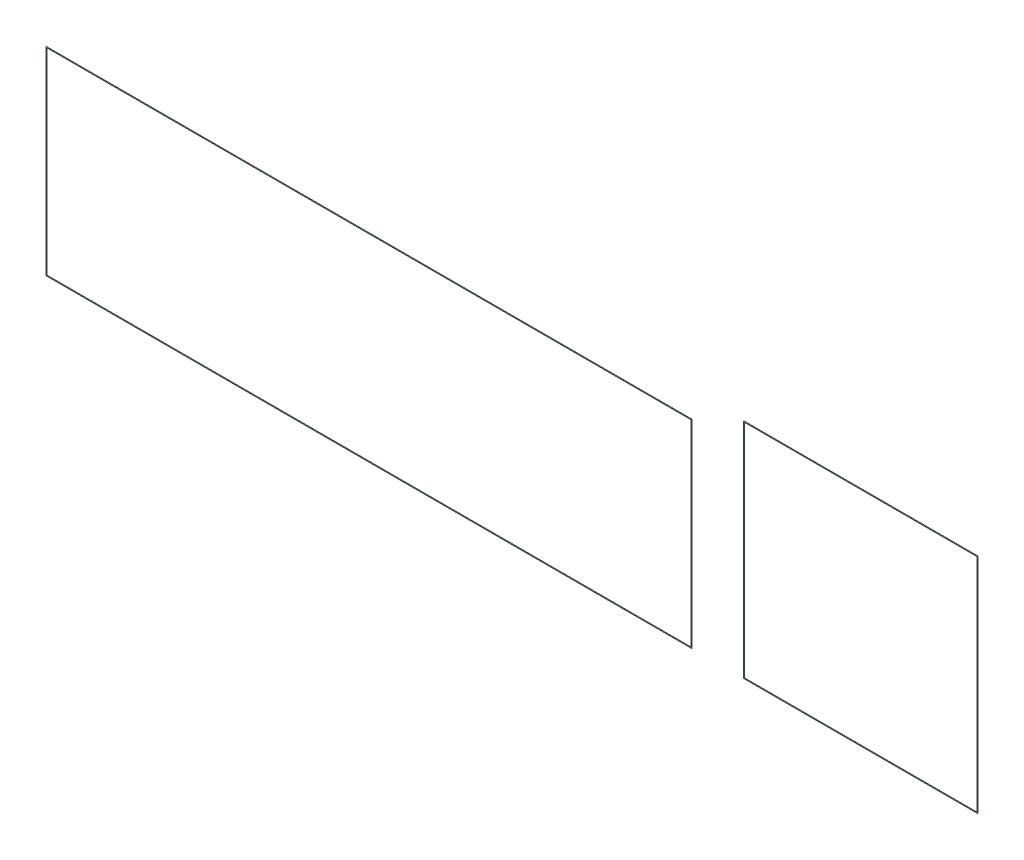
ISO-10303-21;
HEADER;
FILE_DESCRIPTION(('STEP AP214'),'2;1');
FILE_NAME('part.step','',(''),(''),'','','');
FILE_SCHEMA(('AUTOMOTIVE_DESIGN { 1 0 10303 214 1 1 1 1 }'));
ENDSEC;
DATA;
#1=APPLICATION_CONTEXT('core data for automotive mechanical design processes');
#2=APPLICATION_PROTOCOL_DEFINITION('international standard','automotive_design',2000,#1);
#3=PRODUCT_CONTEXT('',#1,'mechanical');
#4=PRODUCT('Part','Part','',(#3));
#5=PRODUCT_RELATED_PRODUCT_CATEGORY('part','',(#4));
#6=PRODUCT_DEFINITION_FORMATION('','',#4);
#7=PRODUCT_DEFINITION_CONTEXT('part definition',#1,'design');
#8=PRODUCT_DEFINITION('design','',#6,#7);
#9=PRODUCT_DEFINITION_SHAPE('','',#8);
#10=(LENGTH_UNIT() NAMED_UNIT(*) SI_UNIT(.MILLI.,.METRE.));
#11=(NAMED_UNIT(*) PLANE_ANGLE_UNIT() SI_UNIT($,.RADIAN.));
#12=(NAMED_UNIT(*) SI_UNIT($,.STERADIAN.) SOLID_ANGLE_UNIT());
#13=UNCERTAINTY_MEASURE_WITH_UNIT(LENGTH_MEASURE(1.E-05),#10,'distance_accuracy_value','');
#14=(GEOMETRIC_REPRESENTATION_CONTEXT(3) GLOBAL_UNCERTAINTY_ASSIGNED_CONTEXT((#13)) GLOBAL_UNIT_ASSIGNED_CONTEXT((#10,
#11,#12)) REPRESENTATION_CONTEXT('',''));
#15=CARTESIAN_POINT('',(0.,0.,0.));
#16=DIRECTION('',(0.,0.,1.));
#17=DIRECTION('',(1.,0.,0.));
#18=AXIS2_PLACEMENT_3D('',#15,#16,#17);
#19=CARTESIAN_POINT('',(0.,0.,1.));
#20=DIRECTION('',(0.,0.,-1.));
#21=DIRECTION('',(-1.,0.,0.));
#22=AXIS2_PLACEMENT_3D('',#19,#20,#21);
#23=PLANE('',#22);
#24=DIRECTION('',(-1.,0.,0.));
#25=VECTOR('',#24,1.);
#26=CARTESIAN_POINT('',(36391.415,12040.,1.));
#27=LINE('',#26,#25);
#28=CARTESIAN_POINT('',(59191.415,12040.,1.));
#29=VERTEX_POINT('',#28);
#30=CARTESIAN_POINT('',(36391.415,12040.,1.));
#31=VERTEX_POINT('',#30);
#32=EDGE_CURVE('E146',#29,#31,#27,.T.);
#33=ORIENTED_EDGE('',*,*,#32,.T.);
#34=DIRECTION('',(0.,-1.,0.));
#35=VECTOR('',#34,1.);
#36=CARTESIAN_POINT('',(36391.415,12040.,1.));
#37=LINE('',#36,#35);
#38=CARTESIAN_POINT('',(36391.415,-9660.,1.));
#39=VERTEX_POINT('',#38);
#40=EDGE_CURVE('E149',#31,#39,#37,.T.);
#41=ORIENTED_EDGE('',*,*,#40,.T.);
#42=DIRECTION('',(1.,0.,0.));
#43=VECTOR('',#42,1.);
#44=CARTESIAN_POINT('',(59191.415,-9660.,1.));
#45=LINE('',#44,#43);
#46=CARTESIAN_POINT('',(59191.415,-9660.,1.));
#47=VERTEX_POINT('',#46);
#48=EDGE_CURVE('E152',#39,#47,#45,.T.);
#49=ORIENTED_EDGE('',*,*,#48,.T.);
#50=DIRECTION('',(0.,1.,0.));
#51=VECTOR('',#50,1.);
#52=CARTESIAN_POINT('',(59191.415,12040.,1.));
#53=LINE('',#52,#51);
#54=EDGE_CURVE('E154',#47,#29,#53,.T.);
#55=ORIENTED_EDGE('',*,*,#54,.T.);
#56=EDGE_LOOP('',(#33,#41,#49,#55));
#57=FACE_BOUND('',#56,.T.);
#58=DIRECTION('',(1.,0.,0.));
#59=VECTOR('',#58,1.);
#60=CARTESIAN_POINT('',(59091.415,-9560.,1.));
#61=LINE('',#60,#59);
#62=CARTESIAN_POINT('',(36491.415,-9560.,1.));
#63=VERTEX_POINT('',#62);
#64=CARTESIAN_POINT('',(59091.415,-9560.,1.));
#65=VERTEX_POINT('',#64);
#66=EDGE_CURVE('E110',#63,#65,#61,.T.);
#67=ORIENTED_EDGE('',*,*,#66,.F.);
#68=DIRECTION('',(0.,-1.,0.));
#69=VECTOR('',#68,1.);
#70=CARTESIAN_POINT('',(36491.415,11940.,1.));
#71=LINE('',#70,#69);
#72=CARTESIAN_POINT('',(36491.415,11940.,1.));
#73=VERTEX_POINT('',#72);
#74=EDGE_CURVE('E132',#73,#63,#71,.T.);
#75=ORIENTED_EDGE('',*,*,#74,.F.);
#76=DIRECTION('',(-1.,0.,0.));
#77=VECTOR('',#76,1.);
#78=CARTESIAN_POINT('',(36491.415,11940.,1.));
#79=LINE('',#78,#77);
#80=CARTESIAN_POINT('',(59091.415,11940.,1.));
#81=VERTEX_POINT('',#80);
#82=EDGE_CURVE('E130',#81,#73,#79,.T.);
#83=ORIENTED_EDGE('',*,*,#82,.F.);
#84=DIRECTION('',(0.,1.,0.));
#85=VECTOR('',#84,1.);
#86=CARTESIAN_POINT('',(59091.415,11940.,1.));
#87=LINE('',#86,#85);
#88=EDGE_CURVE('E118',#65,#81,#87,.T.);
#89=ORIENTED_EDGE('',*,*,#88,.F.);
#90=EDGE_LOOP('',(#67,#75,#83,#89));
#91=FACE_BOUND('',#90,.T.);
#92=ADVANCED_FACE('F45',(#57,#91),#23,.F.);
#93=CARTESIAN_POINT('',(0.,0.,0.));
#94=DIRECTION('',(0.,0.,-1.));
#95=DIRECTION('',(-1.,0.,0.));
#96=AXIS2_PLACEMENT_3D('',#93,#94,#95);
#97=PLANE('',#96);
#98=DIRECTION('',(-1.,0.,0.));
#99=VECTOR('',#98,1.);
#100=CARTESIAN_POINT('',(36391.415,12040.,0.));
#101=LINE('',#100,#99);
#102=CARTESIAN_POINT('',(59191.415,12040.,0.));
#103=VERTEX_POINT('',#102);
#104=CARTESIAN_POINT('',(36391.415,12040.,0.));
#105=VERTEX_POINT('',#104);
#106=EDGE_CURVE('E126',#103,#105,#101,.T.);
#107=ORIENTED_EDGE('',*,*,#106,.F.);
#108=DIRECTION('',(0.,1.,0.));
#109=VECTOR('',#108,1.);
#110=CARTESIAN_POINT('',(59191.415,12040.,0.));
#111=LINE('',#110,#109);
#112=CARTESIAN_POINT('',(59191.415,-9660.,0.));
#113=VERTEX_POINT('',#112);
#114=EDGE_CURVE('E150',#113,#103,#111,.T.);
#115=ORIENTED_EDGE('',*,*,#114,.F.);
#116=DIRECTION('',(1.,0.,0.));
#117=VECTOR('',#116,1.);
#118=CARTESIAN_POINT('',(59191.415,-9660.,0.));
#119=LINE('',#118,#117);
#120=CARTESIAN_POINT('',(36391.415,-9660.,0.));
#121=VERTEX_POINT('',#120);
#122=EDGE_CURVE('E161',#121,#113,#119,.T.);
#123=ORIENTED_EDGE('',*,*,#122,.F.);
#124=DIRECTION('',(0.,-1.,0.));
#125=VECTOR('',#124,1.);
#126=CARTESIAN_POINT('',(36391.415,12040.,0.));
#127=LINE('',#126,#125);
#128=EDGE_CURVE('E159',#105,#121,#127,.T.);
#129=ORIENTED_EDGE('',*,*,#128,.F.);
#130=EDGE_LOOP('',(#107,#115,#123,#129));
#131=FACE_BOUND('',#130,.T.);
#132=DIRECTION('',(0.,-1.,0.));
#133=VECTOR('',#132,1.);
#134=CARTESIAN_POINT('',(36491.415,11940.,0.));
#135=LINE('',#134,#133);
#136=CARTESIAN_POINT('',(36491.415,11940.,0.));
#137=VERTEX_POINT('',#136);
#138=CARTESIAN_POINT('',(36491.415,-9560.,0.));
#139=VERTEX_POINT('',#138);
#140=EDGE_CURVE('E119',#137,#139,#135,.T.);
#141=ORIENTED_EDGE('',*,*,#140,.T.);
#142=DIRECTION('',(1.,0.,0.));
#143=VECTOR('',#142,1.);
#144=CARTESIAN_POINT('',(59091.415,-9560.,0.));
#145=LINE('',#144,#143);
#146=CARTESIAN_POINT('',(59091.415,-9560.,0.));
#147=VERTEX_POINT('',#146);
#148=EDGE_CURVE('E68',#139,#147,#145,.T.);
#149=ORIENTED_EDGE('',*,*,#148,.T.);
#150=DIRECTION('',(0.,1.,0.));
#151=VECTOR('',#150,1.);
#152=CARTESIAN_POINT('',(59091.415,11940.,0.));
#153=LINE('',#152,#151);
#154=CARTESIAN_POINT('',(59091.415,11940.,0.));
#155=VERTEX_POINT('',#154);
#156=EDGE_CURVE('E125',#147,#155,#153,.T.);
#157=ORIENTED_EDGE('',*,*,#156,.T.);
#158=DIRECTION('',(-1.,0.,0.));
#159=VECTOR('',#158,1.);
#160=CARTESIAN_POINT('',(36491.415,11940.,0.));
#161=LINE('',#160,#159);
#162=EDGE_CURVE('E138',#155,#137,#161,.T.);
#163=ORIENTED_EDGE('',*,*,#162,.T.);
#164=EDGE_LOOP('',(#141,#149,#157,#163));
#165=FACE_BOUND('',#164,.T.);
#166=ADVANCED_FACE('F179',(#131,#165),#97,.T.);
#167=CARTESIAN_POINT('',(36391.415,12040.,1.));
#168=DIRECTION('',(0.,-1.,0.));
#169=DIRECTION('',(0.,0.,-1.));
#170=AXIS2_PLACEMENT_3D('',#167,#168,#169);
#171=PLANE('',#170);
#172=ORIENTED_EDGE('',*,*,#106,.T.);
#173=DIRECTION('',(0.,0.,-1.));
#174=VECTOR('',#173,1.);
#175=CARTESIAN_POINT('',(36391.415,12040.,1.));
#176=LINE('',#175,#174);
#177=EDGE_CURVE('E12',#31,#105,#176,.T.);
#178=ORIENTED_EDGE('',*,*,#177,.F.);
#179=ORIENTED_EDGE('',*,*,#32,.F.);
#180=DIRECTION('',(0.,0.,-1.));
#181=VECTOR('',#180,1.);
#182=CARTESIAN_POINT('',(59191.415,12040.,1.));
#183=LINE('',#182,#181);
#184=EDGE_CURVE('E156',#29,#103,#183,.T.);
#185=ORIENTED_EDGE('',*,*,#184,.T.);
#186=EDGE_LOOP('',(#172,#178,#179,#185));
#187=FACE_BOUND('',#186,.T.);
#188=ADVANCED_FACE('F47',(#187),#171,.F.);
#189=CARTESIAN_POINT('',(36391.415,12040.,1.));
#190=DIRECTION('',(1.,0.,0.));
#191=DIRECTION('',(0.,0.,-1.));
#192=AXIS2_PLACEMENT_3D('',#189,#190,#191);
#193=PLANE('',#192);
#194=ORIENTED_EDGE('',*,*,#128,.T.);
#195=DIRECTION('',(0.,0.,-1.));
#196=VECTOR('',#195,1.);
#197=CARTESIAN_POINT('',(36391.415,-9660.,1.));
#198=LINE('',#197,#196);
#199=EDGE_CURVE('E53',#39,#121,#198,.T.);
#200=ORIENTED_EDGE('',*,*,#199,.F.);
#201=ORIENTED_EDGE('',*,*,#40,.F.);
#202=ORIENTED_EDGE('',*,*,#177,.T.);
#203=EDGE_LOOP('',(#194,#200,#201,#202));
#204=FACE_BOUND('',#203,.T.);
#205=ADVANCED_FACE('F189',(#204),#193,.F.);
#206=CARTESIAN_POINT('',(59191.415,-9660.,1.));
#207=DIRECTION('',(0.,1.,0.));
#208=DIRECTION('',(-1.,0.,0.));
#209=AXIS2_PLACEMENT_3D('',#206,#207,#208);
#210=PLANE('',#209);
#211=ORIENTED_EDGE('',*,*,#122,.T.);
#212=DIRECTION('',(0.,0.,-1.));
#213=VECTOR('',#212,1.);
#214=CARTESIAN_POINT('',(59191.415,-9660.,1.));
#215=LINE('',#214,#213);
#216=EDGE_CURVE('E166',#47,#113,#215,.T.);
#217=ORIENTED_EDGE('',*,*,#216,.F.);
#218=ORIENTED_EDGE('',*,*,#48,.F.);
#219=ORIENTED_EDGE('',*,*,#199,.T.);
#220=EDGE_LOOP('',(#211,#217,#218,#219));
#221=FACE_BOUND('',#220,.T.);
#222=ADVANCED_FACE('F173',(#221),#210,.F.);
#223=CARTESIAN_POINT('',(59191.415,12040.,1.));
#224=DIRECTION('',(-1.,0.,0.));
#225=DIRECTION('',(0.,0.,1.));
#226=AXIS2_PLACEMENT_3D('',#223,#224,#225);
#227=PLANE('',#226);
#228=ORIENTED_EDGE('',*,*,#114,.T.);
#229=ORIENTED_EDGE('',*,*,#184,.F.);
#230=ORIENTED_EDGE('',*,*,#54,.F.);
#231=ORIENTED_EDGE('',*,*,#216,.T.);
#232=EDGE_LOOP('',(#228,#229,#230,#231));
#233=FACE_BOUND('',#232,.T.);
#234=ADVANCED_FACE('F183',(#233),#227,.F.);
#235=CARTESIAN_POINT('',(59091.415,-9560.,1.));
#236=DIRECTION('',(0.,1.,0.));
#237=DIRECTION('',(-1.,0.,0.));
#238=AXIS2_PLACEMENT_3D('',#235,#236,#237);
#239=PLANE('',#238);
#240=ORIENTED_EDGE('',*,*,#148,.F.);
#241=DIRECTION('',(0.,0.,-1.));
#242=VECTOR('',#241,1.);
#243=CARTESIAN_POINT('',(36491.415,-9560.,1.));
#244=LINE('',#243,#242);
#245=EDGE_CURVE('E114',#63,#139,#244,.T.);
#246=ORIENTED_EDGE('',*,*,#245,.F.);
#247=ORIENTED_EDGE('',*,*,#66,.T.);
#248=DIRECTION('',(0.,0.,-1.));
#249=VECTOR('',#248,1.);
#250=CARTESIAN_POINT('',(59091.415,-9560.,1.));
#251=LINE('',#250,#249);
#252=EDGE_CURVE('E113',#65,#147,#251,.T.);
#253=ORIENTED_EDGE('',*,*,#252,.T.);
#254=EDGE_LOOP('',(#240,#246,#247,#253));
#255=FACE_BOUND('',#254,.T.);
#256=ADVANCED_FACE('F112',(#255),#239,.T.);
#257=CARTESIAN_POINT('',(59091.415,11940.,1.));
#258=DIRECTION('',(-1.,0.,0.));
#259=DIRECTION('',(0.,-1.,0.));
#260=AXIS2_PLACEMENT_3D('',#257,#258,#259);
#261=PLANE('',#260);
#262=ORIENTED_EDGE('',*,*,#156,.F.);
#263=ORIENTED_EDGE('',*,*,#252,.F.);
#264=ORIENTED_EDGE('',*,*,#88,.T.);
#265=DIRECTION('',(0.,0.,-1.));
#266=VECTOR('',#265,1.);
#267=CARTESIAN_POINT('',(59091.415,11940.,1.));
#268=LINE('',#267,#266);
#269=EDGE_CURVE('E127',#81,#155,#268,.T.);
#270=ORIENTED_EDGE('',*,*,#269,.T.);
#271=EDGE_LOOP('',(#262,#263,#264,#270));
#272=FACE_BOUND('',#271,.T.);
#273=ADVANCED_FACE('F122',(#272),#261,.T.);
#274=CARTESIAN_POINT('',(36491.415,11940.,1.));
#275=DIRECTION('',(0.,-1.,0.));
#276=DIRECTION('',(1.,0.,0.));
#277=AXIS2_PLACEMENT_3D('',#274,#275,#276);
#278=PLANE('',#277);
#279=ORIENTED_EDGE('',*,*,#162,.F.);
#280=ORIENTED_EDGE('',*,*,#269,.F.);
#281=ORIENTED_EDGE('',*,*,#82,.T.);
#282=DIRECTION('',(0.,0.,-1.));
#283=VECTOR('',#282,1.);
#284=CARTESIAN_POINT('',(36491.415,11940.,1.));
#285=LINE('',#284,#283);
#286=EDGE_CURVE('E60',#73,#137,#285,.T.);
#287=ORIENTED_EDGE('',*,*,#286,.T.);
#288=EDGE_LOOP('',(#279,#280,#281,#287));
#289=FACE_BOUND('',#288,.T.);
#290=ADVANCED_FACE('F212',(#289),#278,.T.);
#291=CARTESIAN_POINT('',(36491.415,11940.,1.));
#292=DIRECTION('',(1.,0.,0.));
#293=DIRECTION('',(0.,0.,-1.));
#294=AXIS2_PLACEMENT_3D('',#291,#292,#293);
#295=PLANE('',#294);
#296=ORIENTED_EDGE('',*,*,#140,.F.);
#297=ORIENTED_EDGE('',*,*,#286,.F.);
#298=ORIENTED_EDGE('',*,*,#74,.T.);
#299=ORIENTED_EDGE('',*,*,#245,.T.);
#300=EDGE_LOOP('',(#296,#297,#298,#299));
#301=FACE_BOUND('',#300,.T.);
#302=ADVANCED_FACE('F216',(#301),#295,.T.);
#303=CLOSED_SHELL('',(#92,#166,#188,#205,#222,#234,#256,#273,#290,#302));
#304=MANIFOLD_SOLID_BREP('B2_NOT_SHOWN',#303);
#305=CARTESIAN_POINT('',(0.,0.,1.));
#306=DIRECTION('',(0.,0.,1.));
#307=DIRECTION('',(1.,0.,0.));
#308=AXIS2_PLACEMENT_3D('',#305,#306,#307);
#309=PLANE('',#308);
#310=DIRECTION('',(0.,1.,0.));
#311=VECTOR('',#310,1.);
#312=CARTESIAN_POINT('',(31391.415,9660.,1.));
#313=LINE('',#312,#311);
#314=CARTESIAN_POINT('',(31391.415,-9660.,1.));
#315=VERTEX_POINT('',#314);
#316=CARTESIAN_POINT('',(31391.415,9660.,1.));
#317=VERTEX_POINT('',#316);
#318=EDGE_CURVE('E375',#315,#317,#313,.T.);
#319=ORIENTED_EDGE('',*,*,#318,.T.);
#320=DIRECTION('',(-1.,0.,0.));
#321=VECTOR('',#320,1.);
#322=CARTESIAN_POINT('',(-31391.415,9660.,1.));
#323=LINE('',#322,#321);
#324=CARTESIAN_POINT('',(-31391.415,9660.,1.));
#325=VERTEX_POINT('',#324);
#326=EDGE_CURVE('E378',#317,#325,#323,.T.);
#327=ORIENTED_EDGE('',*,*,#326,.T.);
#328=DIRECTION('',(0.,-1.,0.));
#329=VECTOR('',#328,1.);
#330=CARTESIAN_POINT('',(-31391.415,9660.,1.));
#331=LINE('',#330,#329);
#332=CARTESIAN_POINT('',(-31391.415,-9660.,1.));
#333=VERTEX_POINT('',#332);
#334=EDGE_CURVE('E381',#325,#333,#331,.T.);
#335=ORIENTED_EDGE('',*,*,#334,.T.);
#336=DIRECTION('',(1.,0.,0.));
#337=VECTOR('',#336,1.);
#338=CARTESIAN_POINT('',(-31391.415,-9660.,1.));
#339=LINE('',#338,#337);
#340=EDGE_CURVE('E383',#333,#315,#339,.T.);
#341=ORIENTED_EDGE('',*,*,#340,.T.);
#342=EDGE_LOOP('',(#319,#327,#335,#341));
#343=FACE_BOUND('',#342,.T.);
#344=DIRECTION('',(0.,-1.,0.));
#345=VECTOR('',#344,1.);
#346=CARTESIAN_POINT('',(-31291.415,9560.,1.));
#347=LINE('',#346,#345);
#348=CARTESIAN_POINT('',(-31291.415,9560.,1.));
#349=VERTEX_POINT('',#348);
#350=CARTESIAN_POINT('',(-31291.415,-9560.,1.));
#351=VERTEX_POINT('',#350);
#352=EDGE_CURVE('E347',#349,#351,#347,.T.);
#353=ORIENTED_EDGE('',*,*,#352,.F.);
#354=DIRECTION('',(-1.,0.,0.));
#355=VECTOR('',#354,1.);
#356=CARTESIAN_POINT('',(-31291.415,9560.,1.));
#357=LINE('',#356,#355);
#358=CARTESIAN_POINT('',(31291.415,9560.,1.));
#359=VERTEX_POINT('',#358);
#360=EDGE_CURVE('E339',#359,#349,#357,.T.);
#361=ORIENTED_EDGE('',*,*,#360,.F.);
#362=DIRECTION('',(0.,1.,0.));
#363=VECTOR('',#362,1.);
#364=CARTESIAN_POINT('',(31291.415,9560.,1.));
#365=LINE('',#364,#363);
#366=CARTESIAN_POINT('',(31291.415,-9560.,1.));
#367=VERTEX_POINT('',#366);
#368=EDGE_CURVE('E361',#367,#359,#365,.T.);
#369=ORIENTED_EDGE('',*,*,#368,.F.);
#370=DIRECTION('',(1.,0.,0.));
#371=VECTOR('',#370,1.);
#372=CARTESIAN_POINT('',(-31291.415,-9560.,1.));
#373=LINE('',#372,#371);
#374=EDGE_CURVE('E359',#351,#367,#373,.T.);
#375=ORIENTED_EDGE('',*,*,#374,.F.);
#376=EDGE_LOOP('',(#353,#361,#369,#375));
#377=FACE_BOUND('',#376,.T.);
#378=ADVANCED_FACE('F274',(#343,#377),#309,.T.);
#379=CARTESIAN_POINT('',(0.,0.,0.));
#380=DIRECTION('',(0.,0.,1.));
#381=DIRECTION('',(1.,0.,0.));
#382=AXIS2_PLACEMENT_3D('',#379,#380,#381);
#383=PLANE('',#382);
#384=DIRECTION('',(0.,1.,0.));
#385=VECTOR('',#384,1.);
#386=CARTESIAN_POINT('',(31391.415,9660.,0.));
#387=LINE('',#386,#385);
#388=CARTESIAN_POINT('',(31391.415,-9660.,0.));
#389=VERTEX_POINT('',#388);
#390=CARTESIAN_POINT('',(31391.415,9660.,0.));
#391=VERTEX_POINT('',#390);
#392=EDGE_CURVE('E355',#389,#391,#387,.T.);
#393=ORIENTED_EDGE('',*,*,#392,.F.);
#394=DIRECTION('',(1.,0.,0.));
#395=VECTOR('',#394,1.);
#396=CARTESIAN_POINT('',(-31391.415,-9660.,0.));
#397=LINE('',#396,#395);
#398=CARTESIAN_POINT('',(-31391.415,-9660.,0.));
#399=VERTEX_POINT('',#398);
#400=EDGE_CURVE('E379',#399,#389,#397,.T.);
#401=ORIENTED_EDGE('',*,*,#400,.F.);
#402=DIRECTION('',(0.,-1.,0.));
#403=VECTOR('',#402,1.);
#404=CARTESIAN_POINT('',(-31391.415,9660.,0.));
#405=LINE('',#404,#403);
#406=CARTESIAN_POINT('',(-31391.415,9660.,0.));
#407=VERTEX_POINT('',#406);
#408=EDGE_CURVE('E390',#407,#399,#405,.T.);
#409=ORIENTED_EDGE('',*,*,#408,.F.);
#410=DIRECTION('',(-1.,0.,0.));
#411=VECTOR('',#410,1.);
#412=CARTESIAN_POINT('',(-31391.415,9660.,0.));
#413=LINE('',#412,#411);
#414=EDGE_CURVE('E388',#391,#407,#413,.T.);
#415=ORIENTED_EDGE('',*,*,#414,.F.);
#416=EDGE_LOOP('',(#393,#401,#409,#415));
#417=FACE_BOUND('',#416,.T.);
#418=DIRECTION('',(-1.,0.,0.));
#419=VECTOR('',#418,1.);
#420=CARTESIAN_POINT('',(-31291.415,9560.,0.));
#421=LINE('',#420,#419);
#422=CARTESIAN_POINT('',(31291.415,9560.,0.));
#423=VERTEX_POINT('',#422);
#424=CARTESIAN_POINT('',(-31291.415,9560.,0.));
#425=VERTEX_POINT('',#424);
#426=EDGE_CURVE('E297',#423,#425,#421,.T.);
#427=ORIENTED_EDGE('',*,*,#426,.T.);
#428=DIRECTION('',(0.,-1.,0.));
#429=VECTOR('',#428,1.);
#430=CARTESIAN_POINT('',(-31291.415,9560.,0.));
#431=LINE('',#430,#429);
#432=CARTESIAN_POINT('',(-31291.415,-9560.,0.));
#433=VERTEX_POINT('',#432);
#434=EDGE_CURVE('E354',#425,#433,#431,.T.);
#435=ORIENTED_EDGE('',*,*,#434,.T.);
#436=DIRECTION('',(1.,0.,0.));
#437=VECTOR('',#436,1.);
#438=CARTESIAN_POINT('',(-31291.415,-9560.,0.));
#439=LINE('',#438,#437);
#440=CARTESIAN_POINT('',(31291.415,-9560.,0.));
#441=VERTEX_POINT('',#440);
#442=EDGE_CURVE('E367',#433,#441,#439,.T.);
#443=ORIENTED_EDGE('',*,*,#442,.T.);
#444=DIRECTION('',(0.,1.,0.));
#445=VECTOR('',#444,1.);
#446=CARTESIAN_POINT('',(31291.415,9560.,0.));
#447=LINE('',#446,#445);
#448=EDGE_CURVE('E348',#441,#423,#447,.T.);
#449=ORIENTED_EDGE('',*,*,#448,.T.);
#450=EDGE_LOOP('',(#427,#435,#443,#449));
#451=FACE_BOUND('',#450,.T.);
#452=ADVANCED_FACE('F408',(#417,#451),#383,.F.);
#453=CARTESIAN_POINT('',(31391.415,9660.,1.));
#454=DIRECTION('',(-1.,0.,0.));
#455=DIRECTION('',(0.,-1.,0.));
#456=AXIS2_PLACEMENT_3D('',#453,#454,#455);
#457=PLANE('',#456);
#458=ORIENTED_EDGE('',*,*,#392,.T.);
#459=DIRECTION('',(0.,0.,-1.));
#460=VECTOR('',#459,1.);
#461=CARTESIAN_POINT('',(31391.415,9660.,1.));
#462=LINE('',#461,#460);
#463=EDGE_CURVE('E43',#317,#391,#462,.T.);
#464=ORIENTED_EDGE('',*,*,#463,.F.);
#465=ORIENTED_EDGE('',*,*,#318,.F.);
#466=DIRECTION('',(0.,0.,-1.));
#467=VECTOR('',#466,1.);
#468=CARTESIAN_POINT('',(31391.415,-9660.,1.));
#469=LINE('',#468,#467);
#470=EDGE_CURVE('E385',#315,#389,#469,.T.);
#471=ORIENTED_EDGE('',*,*,#470,.T.);
#472=EDGE_LOOP('',(#458,#464,#465,#471));
#473=FACE_BOUND('',#472,.T.);
#474=ADVANCED_FACE('F276',(#473),#457,.F.);
#475=CARTESIAN_POINT('',(-31391.415,9660.,1.));
#476=DIRECTION('',(0.,-1.,0.));
#477=DIRECTION('',(0.,0.,-1.));
#478=AXIS2_PLACEMENT_3D('',#475,#476,#477);
#479=PLANE('',#478);
#480=ORIENTED_EDGE('',*,*,#414,.T.);
#481=DIRECTION('',(0.,0.,-1.));
#482=VECTOR('',#481,1.);
#483=CARTESIAN_POINT('',(-31391.415,9660.,1.));
#484=LINE('',#483,#482);
#485=EDGE_CURVE('E282',#325,#407,#484,.T.);
#486=ORIENTED_EDGE('',*,*,#485,.F.);
#487=ORIENTED_EDGE('',*,*,#326,.F.);
#488=ORIENTED_EDGE('',*,*,#463,.T.);
#489=EDGE_LOOP('',(#480,#486,#487,#488));
#490=FACE_BOUND('',#489,.T.);
#491=ADVANCED_FACE('F418',(#490),#479,.F.);
#492=CARTESIAN_POINT('',(-31391.415,9660.,1.));
#493=DIRECTION('',(1.,0.,0.));
#494=DIRECTION('',(0.,1.,0.));
#495=AXIS2_PLACEMENT_3D('',#492,#493,#494);
#496=PLANE('',#495);
#497=ORIENTED_EDGE('',*,*,#408,.T.);
#498=DIRECTION('',(0.,0.,-1.));
#499=VECTOR('',#498,1.);
#500=CARTESIAN_POINT('',(-31391.415,-9660.,1.));
#501=LINE('',#500,#499);
#502=EDGE_CURVE('E395',#333,#399,#501,.T.);
#503=ORIENTED_EDGE('',*,*,#502,.F.);
#504=ORIENTED_EDGE('',*,*,#334,.F.);
#505=ORIENTED_EDGE('',*,*,#485,.T.);
#506=EDGE_LOOP('',(#497,#503,#504,#505));
#507=FACE_BOUND('',#506,.T.);
#508=ADVANCED_FACE('F402',(#507),#496,.F.);
#509=CARTESIAN_POINT('',(-31391.415,-9660.,1.));
#510=DIRECTION('',(0.,1.,0.));
#511=DIRECTION('',(0.,0.,1.));
#512=AXIS2_PLACEMENT_3D('',#509,#510,#511);
#513=PLANE('',#512);
#514=ORIENTED_EDGE('',*,*,#400,.T.);
#515=ORIENTED_EDGE('',*,*,#470,.F.);
#516=ORIENTED_EDGE('',*,*,#340,.F.);
#517=ORIENTED_EDGE('',*,*,#502,.T.);
#518=EDGE_LOOP('',(#514,#515,#516,#517));
#519=FACE_BOUND('',#518,.T.);
#520=ADVANCED_FACE('F412',(#519),#513,.F.);
#521=CARTESIAN_POINT('',(-31291.415,9560.,1.));
#522=DIRECTION('',(0.,-1.,0.));
#523=DIRECTION('',(0.,0.,-1.));
#524=AXIS2_PLACEMENT_3D('',#521,#522,#523);
#525=PLANE('',#524);
#526=ORIENTED_EDGE('',*,*,#426,.F.);
#527=DIRECTION('',(0.,0.,-1.));
#528=VECTOR('',#527,1.);
#529=CARTESIAN_POINT('',(31291.415,9560.,1.));
#530=LINE('',#529,#528);
#531=EDGE_CURVE('E343',#359,#423,#530,.T.);
#532=ORIENTED_EDGE('',*,*,#531,.F.);
#533=ORIENTED_EDGE('',*,*,#360,.T.);
#534=DIRECTION('',(0.,0.,-1.));
#535=VECTOR('',#534,1.);
#536=CARTESIAN_POINT('',(-31291.415,9560.,1.));
#537=LINE('',#536,#535);
#538=EDGE_CURVE('E342',#349,#425,#537,.T.);
#539=ORIENTED_EDGE('',*,*,#538,.T.);
#540=EDGE_LOOP('',(#526,#532,#533,#539));
#541=FACE_BOUND('',#540,.T.);
#542=ADVANCED_FACE('F341',(#541),#525,.T.);
#543=CARTESIAN_POINT('',(-31291.415,9560.,1.));
#544=DIRECTION('',(1.,0.,0.));
#545=DIRECTION('',(0.,1.,0.));
#546=AXIS2_PLACEMENT_3D('',#543,#544,#545);
#547=PLANE('',#546);
#548=ORIENTED_EDGE('',*,*,#434,.F.);
#549=ORIENTED_EDGE('',*,*,#538,.F.);
#550=ORIENTED_EDGE('',*,*,#352,.T.);
#551=DIRECTION('',(0.,0.,-1.));
#552=VECTOR('',#551,1.);
#553=CARTESIAN_POINT('',(-31291.415,-9560.,1.));
#554=LINE('',#553,#552);
#555=EDGE_CURVE('E356',#351,#433,#554,.T.);
#556=ORIENTED_EDGE('',*,*,#555,.T.);
#557=EDGE_LOOP('',(#548,#549,#550,#556));
#558=FACE_BOUND('',#557,.T.);
#559=ADVANCED_FACE('F351',(#558),#547,.T.);
#560=CARTESIAN_POINT('',(-31291.415,-9560.,1.));
#561=DIRECTION('',(0.,1.,0.));
#562=DIRECTION('',(0.,0.,1.));
#563=AXIS2_PLACEMENT_3D('',#560,#561,#562);
#564=PLANE('',#563);
#565=ORIENTED_EDGE('',*,*,#442,.F.);
#566=ORIENTED_EDGE('',*,*,#555,.F.);
#567=ORIENTED_EDGE('',*,*,#374,.T.);
#568=DIRECTION('',(0.,0.,-1.));
#569=VECTOR('',#568,1.);
#570=CARTESIAN_POINT('',(31291.415,-9560.,1.));
#571=LINE('',#570,#569);
#572=EDGE_CURVE('E289',#367,#441,#571,.T.);
#573=ORIENTED_EDGE('',*,*,#572,.T.);
#574=EDGE_LOOP('',(#565,#566,#567,#573));
#575=FACE_BOUND('',#574,.T.);
#576=ADVANCED_FACE('F441',(#575),#564,.T.);
#577=CARTESIAN_POINT('',(31291.415,9560.,1.));
#578=DIRECTION('',(-1.,0.,0.));
#579=DIRECTION('',(0.,-1.,0.));
#580=AXIS2_PLACEMENT_3D('',#577,#578,#579);
#581=PLANE('',#580);
#582=ORIENTED_EDGE('',*,*,#448,.F.);
#583=ORIENTED_EDGE('',*,*,#572,.F.);
#584=ORIENTED_EDGE('',*,*,#368,.T.);
#585=ORIENTED_EDGE('',*,*,#531,.T.);
#586=EDGE_LOOP('',(#582,#583,#584,#585));
#587=FACE_BOUND('',#586,.T.);
#588=ADVANCED_FACE('F445',(#587),#581,.T.);
#589=CLOSED_SHELL('',(#378,#452,#474,#491,#508,#520,#542,#559,#576,#588));
#590=MANIFOLD_SOLID_BREP('B6',#589);
#591=ADVANCED_BREP_SHAPE_REPRESENTATION('',(#18,#304,#590),#14);
#592=SHAPE_DEFINITION_REPRESENTATION(#9,#591);
ENDSEC;
END-ISO-10303-21;
